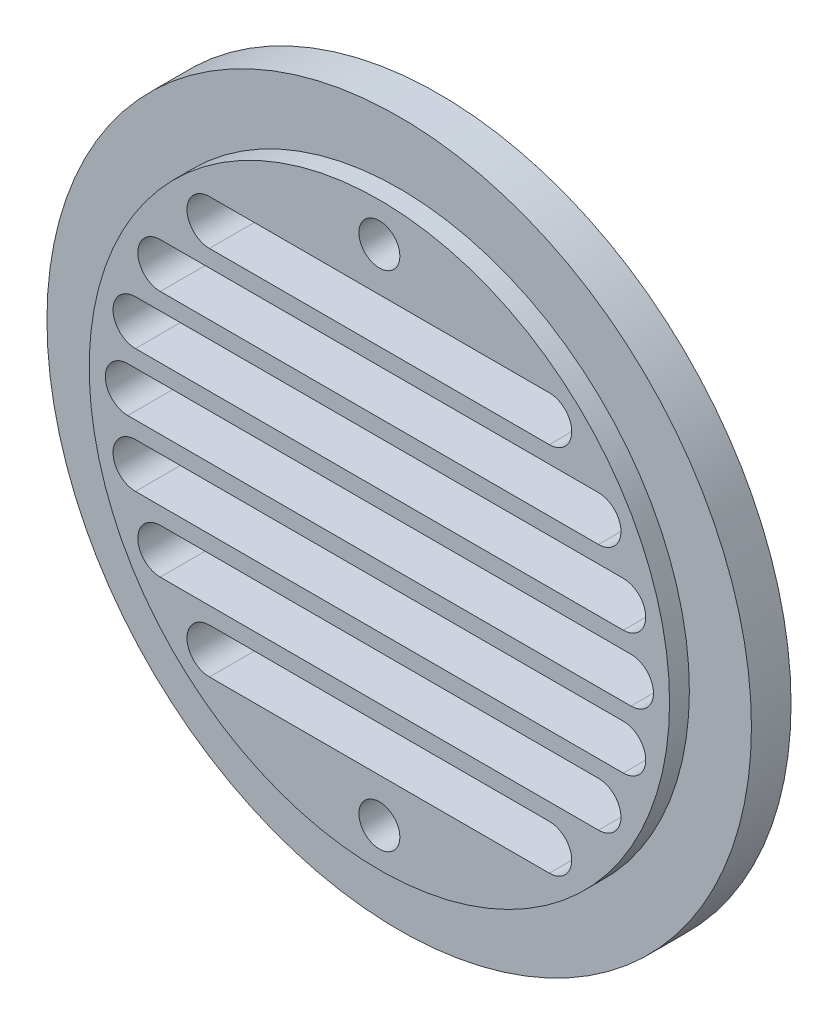
ISO-10303-21;
HEADER;
FILE_DESCRIPTION(('STEP AP214'),'2;1');
FILE_NAME('part.step','',(''),(''),'','','');
FILE_SCHEMA(('AUTOMOTIVE_DESIGN { 1 0 10303 214 1 1 1 1 }'));
ENDSEC;
DATA;
#1=APPLICATION_CONTEXT('core data for automotive mechanical design processes');
#2=APPLICATION_PROTOCOL_DEFINITION('international standard','automotive_design',2000,#1);
#3=PRODUCT_CONTEXT('',#1,'mechanical');
#4=PRODUCT('Part','Part','',(#3));
#5=PRODUCT_RELATED_PRODUCT_CATEGORY('part','',(#4));
#6=PRODUCT_DEFINITION_FORMATION('','',#4);
#7=PRODUCT_DEFINITION_CONTEXT('part definition',#1,'design');
#8=PRODUCT_DEFINITION('design','',#6,#7);
#9=PRODUCT_DEFINITION_SHAPE('','',#8);
#10=(LENGTH_UNIT() NAMED_UNIT(*) SI_UNIT(.MILLI.,.METRE.));
#11=(NAMED_UNIT(*) PLANE_ANGLE_UNIT() SI_UNIT($,.RADIAN.));
#12=(NAMED_UNIT(*) SI_UNIT($,.STERADIAN.) SOLID_ANGLE_UNIT());
#13=UNCERTAINTY_MEASURE_WITH_UNIT(LENGTH_MEASURE(1.E-05),#10,'distance_accuracy_value','');
#14=(GEOMETRIC_REPRESENTATION_CONTEXT(3) GLOBAL_UNCERTAINTY_ASSIGNED_CONTEXT((#13)) GLOBAL_UNIT_ASSIGNED_CONTEXT((#10,
#11,#12)) REPRESENTATION_CONTEXT('',''));
#15=CARTESIAN_POINT('',(0.,0.,0.));
#16=DIRECTION('',(0.,0.,1.));
#17=DIRECTION('',(1.,0.,0.));
#18=AXIS2_PLACEMENT_3D('',#15,#16,#17);
#19=CARTESIAN_POINT('',(0.,0.,3.));
#20=DIRECTION('',(0.,0.,-1.));
#21=DIRECTION('',(-1.,0.,0.));
#22=AXIS2_PLACEMENT_3D('',#19,#20,#21);
#23=CYLINDRICAL_SURFACE('',#22,26.67);
#24=CARTESIAN_POINT('',(0.,0.,3.));
#25=DIRECTION('',(0.,0.,1.));
#26=DIRECTION('',(1.,0.,0.));
#27=AXIS2_PLACEMENT_3D('',#24,#25,#26);
#28=CIRCLE('',#27,26.67);
#29=CARTESIAN_POINT('',(26.67,0.,3.));
#30=VERTEX_POINT('',#29);
#31=EDGE_CURVE('E12',#30,#30,#28,.T.);
#32=ORIENTED_EDGE('',*,*,#31,.F.);
#33=EDGE_LOOP('',(#32));
#34=FACE_BOUND('',#33,.T.);
#35=CARTESIAN_POINT('',(0.,0.,0.));
#36=DIRECTION('',(0.,0.,1.));
#37=DIRECTION('',(1.,0.,0.));
#38=AXIS2_PLACEMENT_3D('',#35,#36,#37);
#39=CIRCLE('',#38,26.67);
#40=CARTESIAN_POINT('',(26.67,0.,0.));
#41=VERTEX_POINT('',#40);
#42=EDGE_CURVE('E44',#41,#41,#39,.T.);
#43=ORIENTED_EDGE('',*,*,#42,.T.);
#44=EDGE_LOOP('',(#43));
#45=FACE_BOUND('',#44,.T.);
#46=ADVANCED_FACE('F41',(#34,#45),#23,.T.);
#47=CARTESIAN_POINT('',(0.,0.,3.));
#48=DIRECTION('',(0.,0.,1.));
#49=DIRECTION('',(1.,0.,0.));
#50=AXIS2_PLACEMENT_3D('',#47,#48,#49);
#51=PLANE('',#50);
#52=CARTESIAN_POINT('',(0.,0.,3.));
#53=DIRECTION('',(0.,0.,1.));
#54=DIRECTION('',(1.,0.,0.));
#55=AXIS2_PLACEMENT_3D('',#52,#53,#54);
#56=CIRCLE('',#55,21.971);
#57=CARTESIAN_POINT('',(21.971,0.,3.));
#58=VERTEX_POINT('',#57);
#59=EDGE_CURVE('E462',#58,#58,#56,.F.);
#60=ORIENTED_EDGE('',*,*,#59,.T.);
#61=EDGE_LOOP('',(#60));
#62=FACE_BOUND('',#61,.T.);
#63=ORIENTED_EDGE('',*,*,#31,.T.);
#64=EDGE_LOOP('',(#63));
#65=FACE_BOUND('',#64,.T.);
#66=ADVANCED_FACE('F474',(#62,#65),#51,.T.);
#67=CARTESIAN_POINT('',(0.,0.,0.));
#68=DIRECTION('',(0.,0.,1.));
#69=DIRECTION('',(1.,0.,0.));
#70=AXIS2_PLACEMENT_3D('',#67,#68,#69);
#71=PLANE('',#70);
#72=CARTESIAN_POINT('',(0.,19.05,0.));
#73=DIRECTION('',(0.,0.,1.));
#74=DIRECTION('',(1.,0.,0.));
#75=AXIS2_PLACEMENT_3D('',#72,#73,#74);
#76=CIRCLE('',#75,1.55);
#77=CARTESIAN_POINT('',(1.55,19.05,0.));
#78=VERTEX_POINT('',#77);
#79=EDGE_CURVE('E463',#78,#78,#76,.T.);
#80=ORIENTED_EDGE('',*,*,#79,.T.);
#81=EDGE_LOOP('',(#80));
#82=FACE_BOUND('',#81,.T.);
#83=DIRECTION('',(-1.,0.,0.));
#84=VECTOR('',#83,1.);
#85=CARTESIAN_POINT('',(-12.8646803302686,-12.35,0.));
#86=LINE('',#85,#84);
#87=CARTESIAN_POINT('',(12.8646803302686,-12.35,0.));
#88=VERTEX_POINT('',#87);
#89=CARTESIAN_POINT('',(-12.8646803302686,-12.35,0.));
#90=VERTEX_POINT('',#89);
#91=EDGE_CURVE('E333',#88,#90,#86,.T.);
#92=ORIENTED_EDGE('',*,*,#91,.T.);
#93=CARTESIAN_POINT('',(-12.8646803302686,-14.05,0.));
#94=DIRECTION('',(0.,0.,1.));
#95=DIRECTION('',(-1.,0.,0.));
#96=AXIS2_PLACEMENT_3D('',#93,#94,#95);
#97=CIRCLE('',#96,1.7);
#98=CARTESIAN_POINT('',(-12.8646803302686,-15.75,0.));
#99=VERTEX_POINT('',#98);
#100=EDGE_CURVE('E344',#90,#99,#97,.T.);
#101=ORIENTED_EDGE('',*,*,#100,.T.);
#102=DIRECTION('',(1.,0.,0.));
#103=VECTOR('',#102,1.);
#104=CARTESIAN_POINT('',(-12.8646803302686,-15.75,0.));
#105=LINE('',#104,#103);
#106=CARTESIAN_POINT('',(12.8646803302686,-15.75,0.));
#107=VERTEX_POINT('',#106);
#108=EDGE_CURVE('E354',#99,#107,#105,.T.);
#109=ORIENTED_EDGE('',*,*,#108,.T.);
#110=CARTESIAN_POINT('',(12.8646803302686,-14.05,0.));
#111=DIRECTION('',(0.,0.,1.));
#112=DIRECTION('',(1.,0.,0.));
#113=AXIS2_PLACEMENT_3D('',#110,#111,#112);
#114=CIRCLE('',#113,1.7);
#115=EDGE_CURVE('E55',#107,#88,#114,.T.);
#116=ORIENTED_EDGE('',*,*,#115,.T.);
#117=EDGE_LOOP('',(#92,#101,#109,#116));
#118=FACE_BOUND('',#117,.T.);
#119=DIRECTION('',(-1.,0.,0.));
#120=VECTOR('',#119,1.);
#121=CARTESIAN_POINT('',(-16.5881902435304,-7.66666666666667,0.));
#122=LINE('',#121,#120);
#123=CARTESIAN_POINT('',(16.5881902435304,-7.66666666666667,0.));
#124=VERTEX_POINT('',#123);
#125=CARTESIAN_POINT('',(-16.5881902435304,-7.66666666666667,0.));
#126=VERTEX_POINT('',#125);
#127=EDGE_CURVE('E303',#124,#126,#122,.T.);
#128=ORIENTED_EDGE('',*,*,#127,.T.);
#129=CARTESIAN_POINT('',(-16.5881902435304,-9.36666666666667,0.));
#130=DIRECTION('',(0.,0.,1.));
#131=DIRECTION('',(-1.,0.,0.));
#132=AXIS2_PLACEMENT_3D('',#129,#130,#131);
#133=CIRCLE('',#132,1.7);
#134=CARTESIAN_POINT('',(-16.5881902435304,-11.0666666666667,0.));
#135=VERTEX_POINT('',#134);
#136=EDGE_CURVE('E315',#126,#135,#133,.T.);
#137=ORIENTED_EDGE('',*,*,#136,.T.);
#138=DIRECTION('',(1.,0.,0.));
#139=VECTOR('',#138,1.);
#140=CARTESIAN_POINT('',(-16.5881902435304,-11.0666666666667,0.));
#141=LINE('',#140,#139);
#142=CARTESIAN_POINT('',(16.5881902435304,-11.0666666666667,0.));
#143=VERTEX_POINT('',#142);
#144=EDGE_CURVE('E325',#135,#143,#141,.T.);
#145=ORIENTED_EDGE('',*,*,#144,.T.);
#146=CARTESIAN_POINT('',(16.5881902435304,-9.36666666666667,0.));
#147=DIRECTION('',(0.,0.,1.));
#148=DIRECTION('',(1.,0.,0.));
#149=AXIS2_PLACEMENT_3D('',#146,#147,#148);
#150=CIRCLE('',#149,1.7);
#151=EDGE_CURVE('E63',#143,#124,#150,.T.);
#152=ORIENTED_EDGE('',*,*,#151,.T.);
#153=EDGE_LOOP('',(#128,#137,#145,#152));
#154=FACE_BOUND('',#153,.T.);
#155=DIRECTION('',(-1.,0.,0.));
#156=VECTOR('',#155,1.);
#157=CARTESIAN_POINT('',(-18.4653429128432,-2.98333333333333,0.));
#158=LINE('',#157,#156);
#159=CARTESIAN_POINT('',(18.4653429128432,-2.98333333333333,0.));
#160=VERTEX_POINT('',#159);
#161=CARTESIAN_POINT('',(-18.4653429128432,-2.98333333333333,0.));
#162=VERTEX_POINT('',#161);
#163=EDGE_CURVE('E271',#160,#162,#158,.T.);
#164=ORIENTED_EDGE('',*,*,#163,.T.);
#165=CARTESIAN_POINT('',(-18.4653429128432,-4.68333333333333,0.));
#166=DIRECTION('',(0.,0.,1.));
#167=DIRECTION('',(-1.,0.,0.));
#168=AXIS2_PLACEMENT_3D('',#165,#166,#167);
#169=CIRCLE('',#168,1.7);
#170=CARTESIAN_POINT('',(-18.4653429128432,-6.38333333333333,0.));
#171=VERTEX_POINT('',#170);
#172=EDGE_CURVE('E283',#162,#171,#169,.T.);
#173=ORIENTED_EDGE('',*,*,#172,.T.);
#174=DIRECTION('',(1.,0.,0.));
#175=VECTOR('',#174,1.);
#176=CARTESIAN_POINT('',(-18.4653429128432,-6.38333333333333,0.));
#177=LINE('',#176,#175);
#178=CARTESIAN_POINT('',(18.4653429128432,-6.38333333333333,0.));
#179=VERTEX_POINT('',#178);
#180=EDGE_CURVE('E295',#171,#179,#177,.T.);
#181=ORIENTED_EDGE('',*,*,#180,.T.);
#182=CARTESIAN_POINT('',(18.4653429128432,-4.68333333333333,0.));
#183=DIRECTION('',(0.,0.,1.));
#184=DIRECTION('',(1.,0.,0.));
#185=AXIS2_PLACEMENT_3D('',#182,#183,#184);
#186=CIRCLE('',#185,1.7);
#187=EDGE_CURVE('E292',#179,#160,#186,.T.);
#188=ORIENTED_EDGE('',*,*,#187,.T.);
#189=EDGE_LOOP('',(#164,#173,#181,#188));
#190=FACE_BOUND('',#189,.T.);
#191=DIRECTION('',(-1.,0.,0.));
#192=VECTOR('',#191,1.);
#193=CARTESIAN_POINT('',(-19.05,1.7,0.));
#194=LINE('',#193,#192);
#195=CARTESIAN_POINT('',(19.05,1.7,0.));
#196=VERTEX_POINT('',#195);
#197=CARTESIAN_POINT('',(-19.05,1.7,0.));
#198=VERTEX_POINT('',#197);
#199=EDGE_CURVE('E258',#196,#198,#194,.T.);
#200=ORIENTED_EDGE('',*,*,#199,.T.);
#201=CARTESIAN_POINT('',(-19.05,0.,0.));
#202=DIRECTION('',(0.,0.,1.));
#203=DIRECTION('',(-1.,0.,0.));
#204=AXIS2_PLACEMENT_3D('',#201,#202,#203);
#205=CIRCLE('',#204,1.7);
#206=CARTESIAN_POINT('',(-19.05,-1.7,0.));
#207=VERTEX_POINT('',#206);
#208=EDGE_CURVE('E231',#198,#207,#205,.T.);
#209=ORIENTED_EDGE('',*,*,#208,.T.);
#210=DIRECTION('',(1.,0.,0.));
#211=VECTOR('',#210,1.);
#212=CARTESIAN_POINT('',(-19.05,-1.7,0.));
#213=LINE('',#212,#211);
#214=CARTESIAN_POINT('',(19.05,-1.7,0.));
#215=VERTEX_POINT('',#214);
#216=EDGE_CURVE('E264',#207,#215,#213,.T.);
#217=ORIENTED_EDGE('',*,*,#216,.T.);
#218=CARTESIAN_POINT('',(19.05,0.,0.));
#219=DIRECTION('',(0.,0.,1.));
#220=DIRECTION('',(1.,0.,0.));
#221=AXIS2_PLACEMENT_3D('',#218,#219,#220);
#222=CIRCLE('',#221,1.7);
#223=EDGE_CURVE('E260',#215,#196,#222,.T.);
#224=ORIENTED_EDGE('',*,*,#223,.T.);
#225=EDGE_LOOP('',(#200,#209,#217,#224));
#226=FACE_BOUND('',#225,.T.);
#227=CARTESIAN_POINT('',(0.,-19.05,0.));
#228=DIRECTION('',(0.,0.,1.));
#229=DIRECTION('',(1.,0.,0.));
#230=AXIS2_PLACEMENT_3D('',#227,#228,#229);
#231=CIRCLE('',#230,1.55);
#232=CARTESIAN_POINT('',(1.55,-19.05,0.));
#233=VERTEX_POINT('',#232);
#234=EDGE_CURVE('E425',#233,#233,#231,.T.);
#235=ORIENTED_EDGE('',*,*,#234,.T.);
#236=EDGE_LOOP('',(#235));
#237=FACE_BOUND('',#236,.T.);
#238=DIRECTION('',(-1.,0.,0.));
#239=VECTOR('',#238,1.);
#240=CARTESIAN_POINT('',(-12.8646803302686,15.75,0.));
#241=LINE('',#240,#239);
#242=CARTESIAN_POINT('',(12.8646803302686,15.75,0.));
#243=VERTEX_POINT('',#242);
#244=CARTESIAN_POINT('',(-12.8646803302686,15.75,0.));
#245=VERTEX_POINT('',#244);
#246=EDGE_CURVE('E432',#243,#245,#241,.T.);
#247=ORIENTED_EDGE('',*,*,#246,.T.);
#248=CARTESIAN_POINT('',(-12.8646803302686,14.05,0.));
#249=DIRECTION('',(0.,0.,1.));
#250=DIRECTION('',(-1.,0.,0.));
#251=AXIS2_PLACEMENT_3D('',#248,#249,#250);
#252=CIRCLE('',#251,1.7);
#253=CARTESIAN_POINT('',(-12.8646803302686,12.35,0.));
#254=VERTEX_POINT('',#253);
#255=EDGE_CURVE('E442',#245,#254,#252,.T.);
#256=ORIENTED_EDGE('',*,*,#255,.T.);
#257=DIRECTION('',(1.,0.,0.));
#258=VECTOR('',#257,1.);
#259=CARTESIAN_POINT('',(-12.8646803302686,12.35,0.));
#260=LINE('',#259,#258);
#261=CARTESIAN_POINT('',(12.8646803302686,12.35,0.));
#262=VERTEX_POINT('',#261);
#263=EDGE_CURVE('E454',#254,#262,#260,.T.);
#264=ORIENTED_EDGE('',*,*,#263,.T.);
#265=CARTESIAN_POINT('',(12.8646803302686,14.05,0.));
#266=DIRECTION('',(0.,0.,1.));
#267=DIRECTION('',(1.,0.,0.));
#268=AXIS2_PLACEMENT_3D('',#265,#266,#267);
#269=CIRCLE('',#268,1.7);
#270=EDGE_CURVE('E451',#262,#243,#269,.T.);
#271=ORIENTED_EDGE('',*,*,#270,.T.);
#272=EDGE_LOOP('',(#247,#256,#264,#271));
#273=FACE_BOUND('',#272,.T.);
#274=DIRECTION('',(-1.,0.,0.));
#275=VECTOR('',#274,1.);
#276=CARTESIAN_POINT('',(-16.5881902435304,11.0666666666667,0.));
#277=LINE('',#276,#275);
#278=CARTESIAN_POINT('',(16.5881902435304,11.0666666666667,0.));
#279=VERTEX_POINT('',#278);
#280=CARTESIAN_POINT('',(-16.5881902435304,11.0666666666667,0.));
#281=VERTEX_POINT('',#280);
#282=EDGE_CURVE('E362',#279,#281,#277,.T.);
#283=ORIENTED_EDGE('',*,*,#282,.T.);
#284=CARTESIAN_POINT('',(-16.5881902435304,9.36666666666667,0.));
#285=DIRECTION('',(0.,0.,1.));
#286=DIRECTION('',(-1.,0.,0.));
#287=AXIS2_PLACEMENT_3D('',#284,#285,#286);
#288=CIRCLE('',#287,1.7);
#289=CARTESIAN_POINT('',(-16.5881902435304,7.66666666666667,0.));
#290=VERTEX_POINT('',#289);
#291=EDGE_CURVE('E374',#281,#290,#288,.T.);
#292=ORIENTED_EDGE('',*,*,#291,.T.);
#293=DIRECTION('',(1.,0.,0.));
#294=VECTOR('',#293,1.);
#295=CARTESIAN_POINT('',(-16.5881902435304,7.66666666666667,0.));
#296=LINE('',#295,#294);
#297=CARTESIAN_POINT('',(16.5881902435304,7.66666666666667,0.));
#298=VERTEX_POINT('',#297);
#299=EDGE_CURVE('E388',#290,#298,#296,.T.);
#300=ORIENTED_EDGE('',*,*,#299,.T.);
#301=CARTESIAN_POINT('',(16.5881902435304,9.36666666666667,0.));
#302=DIRECTION('',(0.,0.,1.));
#303=DIRECTION('',(1.,0.,0.));
#304=AXIS2_PLACEMENT_3D('',#301,#302,#303);
#305=CIRCLE('',#304,1.7);
#306=EDGE_CURVE('E385',#298,#279,#305,.T.);
#307=ORIENTED_EDGE('',*,*,#306,.T.);
#308=EDGE_LOOP('',(#283,#292,#300,#307));
#309=FACE_BOUND('',#308,.T.);
#310=DIRECTION('',(-1.,0.,0.));
#311=VECTOR('',#310,1.);
#312=CARTESIAN_POINT('',(-18.4653429128432,6.38333333333333,0.));
#313=LINE('',#312,#311);
#314=CARTESIAN_POINT('',(18.4653429128432,6.38333333333333,0.));
#315=VERTEX_POINT('',#314);
#316=CARTESIAN_POINT('',(-18.4653429128432,6.38333333333333,0.));
#317=VERTEX_POINT('',#316);
#318=EDGE_CURVE('E396',#315,#317,#313,.T.);
#319=ORIENTED_EDGE('',*,*,#318,.T.);
#320=CARTESIAN_POINT('',(-18.4653429128432,4.68333333333333,0.));
#321=DIRECTION('',(0.,0.,1.));
#322=DIRECTION('',(-1.,0.,0.));
#323=AXIS2_PLACEMENT_3D('',#320,#321,#322);
#324=CIRCLE('',#323,1.7);
#325=CARTESIAN_POINT('',(-18.4653429128432,2.98333333333333,0.));
#326=VERTEX_POINT('',#325);
#327=EDGE_CURVE('E404',#317,#326,#324,.T.);
#328=ORIENTED_EDGE('',*,*,#327,.T.);
#329=DIRECTION('',(1.,0.,0.));
#330=VECTOR('',#329,1.);
#331=CARTESIAN_POINT('',(-18.4653429128432,2.98333333333333,0.));
#332=LINE('',#331,#330);
#333=CARTESIAN_POINT('',(18.4653429128432,2.98333333333333,0.));
#334=VERTEX_POINT('',#333);
#335=EDGE_CURVE('E416',#326,#334,#332,.T.);
#336=ORIENTED_EDGE('',*,*,#335,.T.);
#337=CARTESIAN_POINT('',(18.4653429128432,4.68333333333333,0.));
#338=DIRECTION('',(0.,0.,1.));
#339=DIRECTION('',(1.,0.,0.));
#340=AXIS2_PLACEMENT_3D('',#337,#338,#339);
#341=CIRCLE('',#340,1.7);
#342=EDGE_CURVE('E413',#334,#315,#341,.T.);
#343=ORIENTED_EDGE('',*,*,#342,.T.);
#344=EDGE_LOOP('',(#319,#328,#336,#343));
#345=FACE_BOUND('',#344,.T.);
#346=ORIENTED_EDGE('',*,*,#42,.F.);
#347=EDGE_LOOP('',(#346));
#348=FACE_BOUND('',#347,.T.);
#349=ADVANCED_FACE('F471',(#82,#118,#154,#190,#226,#237,#273,#309,#345,#348),#71,.F.);
#350=CARTESIAN_POINT('',(0.,0.,68.1433723577985));
#351=DIRECTION('',(0.,0.,-1.));
#352=DIRECTION('',(-1.,0.,0.));
#353=AXIS2_PLACEMENT_3D('',#350,#351,#352);
#354=CYLINDRICAL_SURFACE('',#353,21.971);
#355=ORIENTED_EDGE('',*,*,#59,.F.);
#356=EDGE_LOOP('',(#355));
#357=FACE_BOUND('',#356,.T.);
#358=CARTESIAN_POINT('',(0.,0.,4.5));
#359=DIRECTION('',(0.,0.,1.));
#360=DIRECTION('',(1.,0.,0.));
#361=AXIS2_PLACEMENT_3D('',#358,#359,#360);
#362=CIRCLE('',#361,21.971);
#363=CARTESIAN_POINT('',(21.971,0.,4.5));
#364=VERTEX_POINT('',#363);
#365=EDGE_CURVE('E459',#364,#364,#362,.T.);
#366=ORIENTED_EDGE('',*,*,#365,.F.);
#367=EDGE_LOOP('',(#366));
#368=FACE_BOUND('',#367,.T.);
#369=ADVANCED_FACE('F473',(#357,#368),#354,.T.);
#370=CARTESIAN_POINT('',(0.,0.,4.5));
#371=DIRECTION('',(0.,0.,1.));
#372=DIRECTION('',(1.,0.,0.));
#373=AXIS2_PLACEMENT_3D('',#370,#371,#372);
#374=PLANE('',#373);
#375=CARTESIAN_POINT('',(0.,19.05,4.5));
#376=DIRECTION('',(0.,0.,1.));
#377=DIRECTION('',(1.,0.,0.));
#378=AXIS2_PLACEMENT_3D('',#375,#376,#377);
#379=CIRCLE('',#378,1.55);
#380=CARTESIAN_POINT('',(1.55,19.05,4.5));
#381=VERTEX_POINT('',#380);
#382=EDGE_CURVE('E424',#381,#381,#379,.T.);
#383=ORIENTED_EDGE('',*,*,#382,.F.);
#384=EDGE_LOOP('',(#383));
#385=FACE_BOUND('',#384,.T.);
#386=CARTESIAN_POINT('',(-12.8646803302686,-14.05,4.5));
#387=DIRECTION('',(0.,0.,1.));
#388=DIRECTION('',(-1.,0.,0.));
#389=AXIS2_PLACEMENT_3D('',#386,#387,#388);
#390=CIRCLE('',#389,1.7);
#391=CARTESIAN_POINT('',(-12.8646803302686,-12.35,4.5));
#392=VERTEX_POINT('',#391);
#393=CARTESIAN_POINT('',(-12.8646803302686,-15.75,4.5));
#394=VERTEX_POINT('',#393);
#395=EDGE_CURVE('E310',#392,#394,#390,.T.);
#396=ORIENTED_EDGE('',*,*,#395,.F.);
#397=DIRECTION('',(-1.,0.,0.));
#398=VECTOR('',#397,1.);
#399=CARTESIAN_POINT('',(-12.8646803302686,-12.35,4.5));
#400=LINE('',#399,#398);
#401=CARTESIAN_POINT('',(12.8646803302686,-12.35,4.5));
#402=VERTEX_POINT('',#401);
#403=EDGE_CURVE('E340',#402,#392,#400,.T.);
#404=ORIENTED_EDGE('',*,*,#403,.F.);
#405=CARTESIAN_POINT('',(12.8646803302686,-14.05,4.5));
#406=DIRECTION('',(0.,0.,1.));
#407=DIRECTION('',(1.,0.,0.));
#408=AXIS2_PLACEMENT_3D('',#405,#406,#407);
#409=CIRCLE('',#408,1.7);
#410=CARTESIAN_POINT('',(12.8646803302686,-15.75,4.5));
#411=VERTEX_POINT('',#410);
#412=EDGE_CURVE('E343',#411,#402,#409,.T.);
#413=ORIENTED_EDGE('',*,*,#412,.F.);
#414=DIRECTION('',(1.,0.,0.));
#415=VECTOR('',#414,1.);
#416=CARTESIAN_POINT('',(-12.8646803302686,-15.75,4.5));
#417=LINE('',#416,#415);
#418=EDGE_CURVE('E347',#394,#411,#417,.T.);
#419=ORIENTED_EDGE('',*,*,#418,.F.);
#420=EDGE_LOOP('',(#396,#404,#413,#419));
#421=FACE_BOUND('',#420,.T.);
#422=CARTESIAN_POINT('',(-16.5881902435304,-9.36666666666667,4.5));
#423=DIRECTION('',(0.,0.,1.));
#424=DIRECTION('',(-1.,0.,0.));
#425=AXIS2_PLACEMENT_3D('',#422,#423,#424);
#426=CIRCLE('',#425,1.7);
#427=CARTESIAN_POINT('',(-16.5881902435304,-7.66666666666667,4.5));
#428=VERTEX_POINT('',#427);
#429=CARTESIAN_POINT('',(-16.5881902435304,-11.0666666666667,4.5));
#430=VERTEX_POINT('',#429);
#431=EDGE_CURVE('E278',#428,#430,#426,.T.);
#432=ORIENTED_EDGE('',*,*,#431,.F.);
#433=DIRECTION('',(-1.,0.,0.));
#434=VECTOR('',#433,1.);
#435=CARTESIAN_POINT('',(-16.5881902435304,-7.66666666666667,4.5));
#436=LINE('',#435,#434);
#437=CARTESIAN_POINT('',(16.5881902435304,-7.66666666666667,4.5));
#438=VERTEX_POINT('',#437);
#439=EDGE_CURVE('E311',#438,#428,#436,.T.);
#440=ORIENTED_EDGE('',*,*,#439,.F.);
#441=CARTESIAN_POINT('',(16.5881902435304,-9.36666666666667,4.5));
#442=DIRECTION('',(0.,0.,1.));
#443=DIRECTION('',(1.,0.,0.));
#444=AXIS2_PLACEMENT_3D('',#441,#442,#443);
#445=CIRCLE('',#444,1.7);
#446=CARTESIAN_POINT('',(16.5881902435304,-11.0666666666667,4.5));
#447=VERTEX_POINT('',#446);
#448=EDGE_CURVE('E314',#447,#438,#445,.T.);
#449=ORIENTED_EDGE('',*,*,#448,.F.);
#450=DIRECTION('',(1.,0.,0.));
#451=VECTOR('',#450,1.);
#452=CARTESIAN_POINT('',(-16.5881902435304,-11.0666666666667,4.5));
#453=LINE('',#452,#451);
#454=EDGE_CURVE('E318',#430,#447,#453,.T.);
#455=ORIENTED_EDGE('',*,*,#454,.F.);
#456=EDGE_LOOP('',(#432,#440,#449,#455));
#457=FACE_BOUND('',#456,.T.);
#458=CARTESIAN_POINT('',(-18.4653429128432,-4.68333333333333,4.5));
#459=DIRECTION('',(0.,0.,1.));
#460=DIRECTION('',(-1.,0.,0.));
#461=AXIS2_PLACEMENT_3D('',#458,#459,#460);
#462=CIRCLE('',#461,1.7);
#463=CARTESIAN_POINT('',(-18.4653429128432,-2.98333333333333,4.5));
#464=VERTEX_POINT('',#463);
#465=CARTESIAN_POINT('',(-18.4653429128432,-6.38333333333333,4.5));
#466=VERTEX_POINT('',#465);
#467=EDGE_CURVE('E236',#464,#466,#462,.T.);
#468=ORIENTED_EDGE('',*,*,#467,.F.);
#469=DIRECTION('',(-1.,0.,0.));
#470=VECTOR('',#469,1.);
#471=CARTESIAN_POINT('',(-18.4653429128432,-2.98333333333333,4.5));
#472=LINE('',#471,#470);
#473=CARTESIAN_POINT('',(18.4653429128432,-2.98333333333333,4.5));
#474=VERTEX_POINT('',#473);
#475=EDGE_CURVE('E279',#474,#464,#472,.T.);
#476=ORIENTED_EDGE('',*,*,#475,.F.);
#477=CARTESIAN_POINT('',(18.4653429128432,-4.68333333333333,4.5));
#478=DIRECTION('',(0.,0.,1.));
#479=DIRECTION('',(1.,0.,0.));
#480=AXIS2_PLACEMENT_3D('',#477,#478,#479);
#481=CIRCLE('',#480,1.7);
#482=CARTESIAN_POINT('',(18.4653429128432,-6.38333333333333,4.5));
#483=VERTEX_POINT('',#482);
#484=EDGE_CURVE('E282',#483,#474,#481,.T.);
#485=ORIENTED_EDGE('',*,*,#484,.F.);
#486=DIRECTION('',(1.,0.,0.));
#487=VECTOR('',#486,1.);
#488=CARTESIAN_POINT('',(-18.4653429128432,-6.38333333333333,4.5));
#489=LINE('',#488,#487);
#490=EDGE_CURVE('E286',#466,#483,#489,.T.);
#491=ORIENTED_EDGE('',*,*,#490,.F.);
#492=EDGE_LOOP('',(#468,#476,#485,#491));
#493=FACE_BOUND('',#492,.T.);
#494=CARTESIAN_POINT('',(-19.05,0.,4.5));
#495=DIRECTION('',(0.,0.,1.));
#496=DIRECTION('',(-1.,0.,0.));
#497=AXIS2_PLACEMENT_3D('',#494,#495,#496);
#498=CIRCLE('',#497,1.7);
#499=CARTESIAN_POINT('',(-19.05,1.7,4.5));
#500=VERTEX_POINT('',#499);
#501=CARTESIAN_POINT('',(-19.05,-1.7,4.5));
#502=VERTEX_POINT('',#501);
#503=EDGE_CURVE('E228',#500,#502,#498,.T.);
#504=ORIENTED_EDGE('',*,*,#503,.F.);
#505=DIRECTION('',(-1.,0.,0.));
#506=VECTOR('',#505,1.);
#507=CARTESIAN_POINT('',(-19.05,1.7,4.5));
#508=LINE('',#507,#506);
#509=CARTESIAN_POINT('',(19.05,1.7,4.5));
#510=VERTEX_POINT('',#509);
#511=EDGE_CURVE('E239',#510,#500,#508,.T.);
#512=ORIENTED_EDGE('',*,*,#511,.F.);
#513=CARTESIAN_POINT('',(19.05,0.,4.5));
#514=DIRECTION('',(0.,0.,1.));
#515=DIRECTION('',(1.,0.,0.));
#516=AXIS2_PLACEMENT_3D('',#513,#514,#515);
#517=CIRCLE('',#516,1.7);
#518=CARTESIAN_POINT('',(19.05,-1.7,4.5));
#519=VERTEX_POINT('',#518);
#520=EDGE_CURVE('E244',#519,#510,#517,.T.);
#521=ORIENTED_EDGE('',*,*,#520,.F.);
#522=DIRECTION('',(1.,0.,0.));
#523=VECTOR('',#522,1.);
#524=CARTESIAN_POINT('',(-19.05,-1.7,4.5));
#525=LINE('',#524,#523);
#526=EDGE_CURVE('E250',#502,#519,#525,.T.);
#527=ORIENTED_EDGE('',*,*,#526,.F.);
#528=EDGE_LOOP('',(#504,#512,#521,#527));
#529=FACE_BOUND('',#528,.T.);
#530=CARTESIAN_POINT('',(0.,-19.05,4.5));
#531=DIRECTION('',(0.,0.,1.));
#532=DIRECTION('',(1.,0.,0.));
#533=AXIS2_PLACEMENT_3D('',#530,#531,#532);
#534=CIRCLE('',#533,1.55);
#535=CARTESIAN_POINT('',(1.55,-19.05,4.5));
#536=VERTEX_POINT('',#535);
#537=EDGE_CURVE('E421',#536,#536,#534,.T.);
#538=ORIENTED_EDGE('',*,*,#537,.F.);
#539=EDGE_LOOP('',(#538));
#540=FACE_BOUND('',#539,.T.);
#541=CARTESIAN_POINT('',(-12.8646803302686,14.05,4.5));
#542=DIRECTION('',(0.,0.,1.));
#543=DIRECTION('',(-1.,0.,0.));
#544=AXIS2_PLACEMENT_3D('',#541,#542,#543);
#545=CIRCLE('',#544,1.7);
#546=CARTESIAN_POINT('',(-12.8646803302686,15.75,4.5));
#547=VERTEX_POINT('',#546);
#548=CARTESIAN_POINT('',(-12.8646803302686,12.35,4.5));
#549=VERTEX_POINT('',#548);
#550=EDGE_CURVE('E428',#547,#549,#545,.T.);
#551=ORIENTED_EDGE('',*,*,#550,.F.);
#552=DIRECTION('',(-1.,0.,0.));
#553=VECTOR('',#552,1.);
#554=CARTESIAN_POINT('',(-12.8646803302686,15.75,4.5));
#555=LINE('',#554,#553);
#556=CARTESIAN_POINT('',(12.8646803302686,15.75,4.5));
#557=VERTEX_POINT('',#556);
#558=EDGE_CURVE('E438',#557,#547,#555,.T.);
#559=ORIENTED_EDGE('',*,*,#558,.F.);
#560=CARTESIAN_POINT('',(12.8646803302686,14.05,4.5));
#561=DIRECTION('',(0.,0.,1.));
#562=DIRECTION('',(1.,0.,0.));
#563=AXIS2_PLACEMENT_3D('',#560,#561,#562);
#564=CIRCLE('',#563,1.7);
#565=CARTESIAN_POINT('',(12.8646803302686,12.35,4.5));
#566=VERTEX_POINT('',#565);
#567=EDGE_CURVE('E441',#566,#557,#564,.T.);
#568=ORIENTED_EDGE('',*,*,#567,.F.);
#569=DIRECTION('',(1.,0.,0.));
#570=VECTOR('',#569,1.);
#571=CARTESIAN_POINT('',(-12.8646803302686,12.35,4.5));
#572=LINE('',#571,#570);
#573=EDGE_CURVE('E445',#549,#566,#572,.T.);
#574=ORIENTED_EDGE('',*,*,#573,.F.);
#575=EDGE_LOOP('',(#551,#559,#568,#574));
#576=FACE_BOUND('',#575,.T.);
#577=CARTESIAN_POINT('',(-16.5881902435304,9.36666666666667,4.5));
#578=DIRECTION('',(0.,0.,1.));
#579=DIRECTION('',(-1.,0.,0.));
#580=AXIS2_PLACEMENT_3D('',#577,#578,#579);
#581=CIRCLE('',#580,1.7);
#582=CARTESIAN_POINT('',(-16.5881902435304,11.0666666666667,4.5));
#583=VERTEX_POINT('',#582);
#584=CARTESIAN_POINT('',(-16.5881902435304,7.66666666666667,4.5));
#585=VERTEX_POINT('',#584);
#586=EDGE_CURVE('E380',#583,#585,#581,.T.);
#587=ORIENTED_EDGE('',*,*,#586,.F.);
#588=DIRECTION('',(-1.,0.,0.));
#589=VECTOR('',#588,1.);
#590=CARTESIAN_POINT('',(-16.5881902435304,11.0666666666667,4.5));
#591=LINE('',#590,#589);
#592=CARTESIAN_POINT('',(16.5881902435304,11.0666666666667,4.5));
#593=VERTEX_POINT('',#592);
#594=EDGE_CURVE('E370',#593,#583,#591,.T.);
#595=ORIENTED_EDGE('',*,*,#594,.F.);
#596=CARTESIAN_POINT('',(16.5881902435304,9.36666666666667,4.5));
#597=DIRECTION('',(0.,0.,1.));
#598=DIRECTION('',(1.,0.,0.));
#599=AXIS2_PLACEMENT_3D('',#596,#597,#598);
#600=CIRCLE('',#599,1.7);
#601=CARTESIAN_POINT('',(16.5881902435304,7.66666666666667,4.5));
#602=VERTEX_POINT('',#601);
#603=EDGE_CURVE('E373',#602,#593,#600,.T.);
#604=ORIENTED_EDGE('',*,*,#603,.F.);
#605=DIRECTION('',(1.,0.,0.));
#606=VECTOR('',#605,1.);
#607=CARTESIAN_POINT('',(-16.5881902435304,7.66666666666667,4.5));
#608=LINE('',#607,#606);
#609=EDGE_CURVE('E377',#585,#602,#608,.T.);
#610=ORIENTED_EDGE('',*,*,#609,.F.);
#611=EDGE_LOOP('',(#587,#595,#604,#610));
#612=FACE_BOUND('',#611,.T.);
#613=CARTESIAN_POINT('',(-18.4653429128432,4.68333333333333,4.5));
#614=DIRECTION('',(0.,0.,1.));
#615=DIRECTION('',(-1.,0.,0.));
#616=AXIS2_PLACEMENT_3D('',#613,#614,#615);
#617=CIRCLE('',#616,1.7);
#618=CARTESIAN_POINT('',(-18.4653429128432,6.38333333333333,4.5));
#619=VERTEX_POINT('',#618);
#620=CARTESIAN_POINT('',(-18.4653429128432,2.98333333333333,4.5));
#621=VERTEX_POINT('',#620);
#622=EDGE_CURVE('E369',#619,#621,#617,.T.);
#623=ORIENTED_EDGE('',*,*,#622,.F.);
#624=DIRECTION('',(-1.,0.,0.));
#625=VECTOR('',#624,1.);
#626=CARTESIAN_POINT('',(-18.4653429128432,6.38333333333333,4.5));
#627=LINE('',#626,#625);
#628=CARTESIAN_POINT('',(18.4653429128432,6.38333333333333,4.5));
#629=VERTEX_POINT('',#628);
#630=EDGE_CURVE('E400',#629,#619,#627,.T.);
#631=ORIENTED_EDGE('',*,*,#630,.F.);
#632=CARTESIAN_POINT('',(18.4653429128432,4.68333333333333,4.5));
#633=DIRECTION('',(0.,0.,1.));
#634=DIRECTION('',(1.,0.,0.));
#635=AXIS2_PLACEMENT_3D('',#632,#633,#634);
#636=CIRCLE('',#635,1.7);
#637=CARTESIAN_POINT('',(18.4653429128432,2.98333333333333,4.5));
#638=VERTEX_POINT('',#637);
#639=EDGE_CURVE('E403',#638,#629,#636,.T.);
#640=ORIENTED_EDGE('',*,*,#639,.F.);
#641=DIRECTION('',(1.,0.,0.));
#642=VECTOR('',#641,1.);
#643=CARTESIAN_POINT('',(-18.4653429128432,2.98333333333333,4.5));
#644=LINE('',#643,#642);
#645=EDGE_CURVE('E407',#621,#638,#644,.T.);
#646=ORIENTED_EDGE('',*,*,#645,.F.);
#647=EDGE_LOOP('',(#623,#631,#640,#646));
#648=FACE_BOUND('',#647,.T.);
#649=ORIENTED_EDGE('',*,*,#365,.T.);
#650=EDGE_LOOP('',(#649));
#651=FACE_BOUND('',#650,.T.);
#652=ADVANCED_FACE('F247',(#385,#421,#457,#493,#529,#540,#576,#612,#648,#651),#374,.T.);
#653=CARTESIAN_POINT('',(-18.4653429128432,4.68333333333333,0.));
#654=DIRECTION('',(0.,0.,1.));
#655=DIRECTION('',(1.,0.,0.));
#656=AXIS2_PLACEMENT_3D('',#653,#654,#655);
#657=CYLINDRICAL_SURFACE('',#656,1.7);
#658=ORIENTED_EDGE('',*,*,#622,.T.);
#659=DIRECTION('',(0.,0.,1.));
#660=VECTOR('',#659,1.);
#661=CARTESIAN_POINT('',(-18.4653429128432,2.98333333333333,0.));
#662=LINE('',#661,#660);
#663=EDGE_CURVE('E393',#326,#621,#662,.T.);
#664=ORIENTED_EDGE('',*,*,#663,.F.);
#665=ORIENTED_EDGE('',*,*,#327,.F.);
#666=DIRECTION('',(0.,0.,1.));
#667=VECTOR('',#666,1.);
#668=CARTESIAN_POINT('',(-18.4653429128432,6.38333333333333,0.));
#669=LINE('',#668,#667);
#670=EDGE_CURVE('E251',#317,#619,#669,.T.);
#671=ORIENTED_EDGE('',*,*,#670,.T.);
#672=EDGE_LOOP('',(#658,#664,#665,#671));
#673=FACE_BOUND('',#672,.T.);
#674=ADVANCED_FACE('F517',(#673),#657,.F.);
#675=CARTESIAN_POINT('',(-18.4653429128432,6.38333333333333,0.));
#676=DIRECTION('',(0.,1.,0.));
#677=DIRECTION('',(0.,0.,1.));
#678=AXIS2_PLACEMENT_3D('',#675,#676,#677);
#679=PLANE('',#678);
#680=ORIENTED_EDGE('',*,*,#630,.T.);
#681=ORIENTED_EDGE('',*,*,#670,.F.);
#682=ORIENTED_EDGE('',*,*,#318,.F.);
#683=DIRECTION('',(0.,0.,1.));
#684=VECTOR('',#683,1.);
#685=CARTESIAN_POINT('',(18.4653429128432,6.38333333333333,0.));
#686=LINE('',#685,#684);
#687=EDGE_CURVE('E253',#315,#629,#686,.T.);
#688=ORIENTED_EDGE('',*,*,#687,.T.);
#689=EDGE_LOOP('',(#680,#681,#682,#688));
#690=FACE_BOUND('',#689,.T.);
#691=ADVANCED_FACE('F528',(#690),#679,.F.);
#692=CARTESIAN_POINT('',(18.4653429128432,4.68333333333333,0.));
#693=DIRECTION('',(0.,0.,1.));
#694=DIRECTION('',(1.,0.,0.));
#695=AXIS2_PLACEMENT_3D('',#692,#693,#694);
#696=CYLINDRICAL_SURFACE('',#695,1.7);
#697=ORIENTED_EDGE('',*,*,#639,.T.);
#698=ORIENTED_EDGE('',*,*,#687,.F.);
#699=ORIENTED_EDGE('',*,*,#342,.F.);
#700=DIRECTION('',(0.,0.,1.));
#701=VECTOR('',#700,1.);
#702=CARTESIAN_POINT('',(18.4653429128432,2.98333333333333,0.));
#703=LINE('',#702,#701);
#704=EDGE_CURVE('E397',#334,#638,#703,.T.);
#705=ORIENTED_EDGE('',*,*,#704,.T.);
#706=EDGE_LOOP('',(#697,#698,#699,#705));
#707=FACE_BOUND('',#706,.T.);
#708=ADVANCED_FACE('F539',(#707),#696,.F.);
#709=CARTESIAN_POINT('',(-18.4653429128432,2.98333333333333,0.));
#710=DIRECTION('',(0.,-1.,0.));
#711=DIRECTION('',(0.,0.,-1.));
#712=AXIS2_PLACEMENT_3D('',#709,#710,#711);
#713=PLANE('',#712);
#714=ORIENTED_EDGE('',*,*,#645,.T.);
#715=ORIENTED_EDGE('',*,*,#704,.F.);
#716=ORIENTED_EDGE('',*,*,#335,.F.);
#717=ORIENTED_EDGE('',*,*,#663,.T.);
#718=EDGE_LOOP('',(#714,#715,#716,#717));
#719=FACE_BOUND('',#718,.T.);
#720=ADVANCED_FACE('F550',(#719),#713,.F.);
#721=CARTESIAN_POINT('',(-16.5881902435304,9.36666666666667,0.));
#722=DIRECTION('',(0.,0.,1.));
#723=DIRECTION('',(1.,0.,0.));
#724=AXIS2_PLACEMENT_3D('',#721,#722,#723);
#725=CYLINDRICAL_SURFACE('',#724,1.7);
#726=ORIENTED_EDGE('',*,*,#586,.T.);
#727=DIRECTION('',(0.,0.,1.));
#728=VECTOR('',#727,1.);
#729=CARTESIAN_POINT('',(-16.5881902435304,7.66666666666667,0.));
#730=LINE('',#729,#728);
#731=EDGE_CURVE('E359',#290,#585,#730,.T.);
#732=ORIENTED_EDGE('',*,*,#731,.F.);
#733=ORIENTED_EDGE('',*,*,#291,.F.);
#734=DIRECTION('',(0.,0.,1.));
#735=VECTOR('',#734,1.);
#736=CARTESIAN_POINT('',(-16.5881902435304,11.0666666666667,0.));
#737=LINE('',#736,#735);
#738=EDGE_CURVE('E367',#281,#583,#737,.T.);
#739=ORIENTED_EDGE('',*,*,#738,.T.);
#740=EDGE_LOOP('',(#726,#732,#733,#739));
#741=FACE_BOUND('',#740,.T.);
#742=ADVANCED_FACE('F561',(#741),#725,.F.);
#743=CARTESIAN_POINT('',(-16.5881902435304,11.0666666666667,0.));
#744=DIRECTION('',(0.,1.,0.));
#745=DIRECTION('',(0.,0.,1.));
#746=AXIS2_PLACEMENT_3D('',#743,#744,#745);
#747=PLANE('',#746);
#748=ORIENTED_EDGE('',*,*,#594,.T.);
#749=ORIENTED_EDGE('',*,*,#738,.F.);
#750=ORIENTED_EDGE('',*,*,#282,.F.);
#751=DIRECTION('',(0.,0.,1.));
#752=VECTOR('',#751,1.);
#753=CARTESIAN_POINT('',(16.5881902435304,11.0666666666667,0.));
#754=LINE('',#753,#752);
#755=EDGE_CURVE('E365',#279,#593,#754,.T.);
#756=ORIENTED_EDGE('',*,*,#755,.T.);
#757=EDGE_LOOP('',(#748,#749,#750,#756));
#758=FACE_BOUND('',#757,.T.);
#759=ADVANCED_FACE('F572',(#758),#747,.F.);
#760=CARTESIAN_POINT('',(16.5881902435304,9.36666666666667,0.));
#761=DIRECTION('',(0.,0.,1.));
#762=DIRECTION('',(1.,0.,0.));
#763=AXIS2_PLACEMENT_3D('',#760,#761,#762);
#764=CYLINDRICAL_SURFACE('',#763,1.7);
#765=ORIENTED_EDGE('',*,*,#603,.T.);
#766=ORIENTED_EDGE('',*,*,#755,.F.);
#767=ORIENTED_EDGE('',*,*,#306,.F.);
#768=DIRECTION('',(0.,0.,1.));
#769=VECTOR('',#768,1.);
#770=CARTESIAN_POINT('',(16.5881902435304,7.66666666666667,0.));
#771=LINE('',#770,#769);
#772=EDGE_CURVE('E363',#298,#602,#771,.T.);
#773=ORIENTED_EDGE('',*,*,#772,.T.);
#774=EDGE_LOOP('',(#765,#766,#767,#773));
#775=FACE_BOUND('',#774,.T.);
#776=ADVANCED_FACE('F583',(#775),#764,.F.);
#777=CARTESIAN_POINT('',(-16.5881902435304,7.66666666666667,0.));
#778=DIRECTION('',(0.,-1.,0.));
#779=DIRECTION('',(0.,0.,-1.));
#780=AXIS2_PLACEMENT_3D('',#777,#778,#779);
#781=PLANE('',#780);
#782=ORIENTED_EDGE('',*,*,#609,.T.);
#783=ORIENTED_EDGE('',*,*,#772,.F.);
#784=ORIENTED_EDGE('',*,*,#299,.F.);
#785=ORIENTED_EDGE('',*,*,#731,.T.);
#786=EDGE_LOOP('',(#782,#783,#784,#785));
#787=FACE_BOUND('',#786,.T.);
#788=ADVANCED_FACE('F594',(#787),#781,.F.);
#789=CARTESIAN_POINT('',(-12.8646803302686,14.05,0.));
#790=DIRECTION('',(0.,0.,1.));
#791=DIRECTION('',(1.,0.,0.));
#792=AXIS2_PLACEMENT_3D('',#789,#790,#791);
#793=CYLINDRICAL_SURFACE('',#792,1.7);
#794=ORIENTED_EDGE('',*,*,#550,.T.);
#795=DIRECTION('',(0.,0.,1.));
#796=VECTOR('',#795,1.);
#797=CARTESIAN_POINT('',(-12.8646803302686,12.35,0.));
#798=LINE('',#797,#796);
#799=EDGE_CURVE('E429',#254,#549,#798,.T.);
#800=ORIENTED_EDGE('',*,*,#799,.F.);
#801=ORIENTED_EDGE('',*,*,#255,.F.);
#802=DIRECTION('',(0.,0.,1.));
#803=VECTOR('',#802,1.);
#804=CARTESIAN_POINT('',(-12.8646803302686,15.75,0.));
#805=LINE('',#804,#803);
#806=EDGE_CURVE('E382',#245,#547,#805,.T.);
#807=ORIENTED_EDGE('',*,*,#806,.T.);
#808=EDGE_LOOP('',(#794,#800,#801,#807));
#809=FACE_BOUND('',#808,.T.);
#810=ADVANCED_FACE('F605',(#809),#793,.F.);
#811=CARTESIAN_POINT('',(-12.8646803302686,15.75,0.));
#812=DIRECTION('',(0.,1.,0.));
#813=DIRECTION('',(0.,0.,1.));
#814=AXIS2_PLACEMENT_3D('',#811,#812,#813);
#815=PLANE('',#814);
#816=ORIENTED_EDGE('',*,*,#558,.T.);
#817=ORIENTED_EDGE('',*,*,#806,.F.);
#818=ORIENTED_EDGE('',*,*,#246,.F.);
#819=DIRECTION('',(0.,0.,1.));
#820=VECTOR('',#819,1.);
#821=CARTESIAN_POINT('',(12.8646803302686,15.75,0.));
#822=LINE('',#821,#820);
#823=EDGE_CURVE('E435',#243,#557,#822,.T.);
#824=ORIENTED_EDGE('',*,*,#823,.T.);
#825=EDGE_LOOP('',(#816,#817,#818,#824));
#826=FACE_BOUND('',#825,.T.);
#827=ADVANCED_FACE('F616',(#826),#815,.F.);
#828=CARTESIAN_POINT('',(12.8646803302686,14.05,0.));
#829=DIRECTION('',(0.,0.,1.));
#830=DIRECTION('',(1.,0.,0.));
#831=AXIS2_PLACEMENT_3D('',#828,#829,#830);
#832=CYLINDRICAL_SURFACE('',#831,1.7);
#833=ORIENTED_EDGE('',*,*,#567,.T.);
#834=ORIENTED_EDGE('',*,*,#823,.F.);
#835=ORIENTED_EDGE('',*,*,#270,.F.);
#836=DIRECTION('',(0.,0.,1.));
#837=VECTOR('',#836,1.);
#838=CARTESIAN_POINT('',(12.8646803302686,12.35,0.));
#839=LINE('',#838,#837);
#840=EDGE_CURVE('E433',#262,#566,#839,.T.);
#841=ORIENTED_EDGE('',*,*,#840,.T.);
#842=EDGE_LOOP('',(#833,#834,#835,#841));
#843=FACE_BOUND('',#842,.T.);
#844=ADVANCED_FACE('F627',(#843),#832,.F.);
#845=CARTESIAN_POINT('',(-12.8646803302686,12.35,0.));
#846=DIRECTION('',(0.,-1.,0.));
#847=DIRECTION('',(0.,0.,-1.));
#848=AXIS2_PLACEMENT_3D('',#845,#846,#847);
#849=PLANE('',#848);
#850=ORIENTED_EDGE('',*,*,#573,.T.);
#851=ORIENTED_EDGE('',*,*,#840,.F.);
#852=ORIENTED_EDGE('',*,*,#263,.F.);
#853=ORIENTED_EDGE('',*,*,#799,.T.);
#854=EDGE_LOOP('',(#850,#851,#852,#853));
#855=FACE_BOUND('',#854,.T.);
#856=ADVANCED_FACE('F638',(#855),#849,.F.);
#857=CARTESIAN_POINT('',(0.,-19.05,0.));
#858=DIRECTION('',(0.,0.,1.));
#859=DIRECTION('',(1.,0.,0.));
#860=AXIS2_PLACEMENT_3D('',#857,#858,#859);
#861=CYLINDRICAL_SURFACE('',#860,1.55);
#862=ORIENTED_EDGE('',*,*,#234,.F.);
#863=EDGE_LOOP('',(#862));
#864=FACE_BOUND('',#863,.T.);
#865=ORIENTED_EDGE('',*,*,#537,.T.);
#866=EDGE_LOOP('',(#865));
#867=FACE_BOUND('',#866,.T.);
#868=ADVANCED_FACE('F649',(#864,#867),#861,.F.);
#869=CARTESIAN_POINT('',(-19.05,0.,0.));
#870=DIRECTION('',(0.,0.,1.));
#871=DIRECTION('',(1.,0.,0.));
#872=AXIS2_PLACEMENT_3D('',#869,#870,#871);
#873=CYLINDRICAL_SURFACE('',#872,1.7);
#874=ORIENTED_EDGE('',*,*,#503,.T.);
#875=DIRECTION('',(0.,0.,1.));
#876=VECTOR('',#875,1.);
#877=CARTESIAN_POINT('',(-19.05,-1.7,0.));
#878=LINE('',#877,#876);
#879=EDGE_CURVE('E261',#207,#502,#878,.T.);
#880=ORIENTED_EDGE('',*,*,#879,.F.);
#881=ORIENTED_EDGE('',*,*,#208,.F.);
#882=DIRECTION('',(0.,0.,1.));
#883=VECTOR('',#882,1.);
#884=CARTESIAN_POINT('',(-19.05,1.7,0.));
#885=LINE('',#884,#883);
#886=EDGE_CURVE('E224',#198,#500,#885,.T.);
#887=ORIENTED_EDGE('',*,*,#886,.T.);
#888=EDGE_LOOP('',(#874,#880,#881,#887));
#889=FACE_BOUND('',#888,.T.);
#890=ADVANCED_FACE('F226',(#889),#873,.F.);
#891=CARTESIAN_POINT('',(-19.05,1.7,0.));
#892=DIRECTION('',(0.,1.,0.));
#893=DIRECTION('',(0.,0.,1.));
#894=AXIS2_PLACEMENT_3D('',#891,#892,#893);
#895=PLANE('',#894);
#896=ORIENTED_EDGE('',*,*,#511,.T.);
#897=ORIENTED_EDGE('',*,*,#886,.F.);
#898=ORIENTED_EDGE('',*,*,#199,.F.);
#899=DIRECTION('',(0.,0.,1.));
#900=VECTOR('',#899,1.);
#901=CARTESIAN_POINT('',(19.05,1.7,0.));
#902=LINE('',#901,#900);
#903=EDGE_CURVE('E235',#196,#510,#902,.T.);
#904=ORIENTED_EDGE('',*,*,#903,.T.);
#905=EDGE_LOOP('',(#896,#897,#898,#904));
#906=FACE_BOUND('',#905,.T.);
#907=ADVANCED_FACE('F240',(#906),#895,.F.);
#908=CARTESIAN_POINT('',(19.05,0.,0.));
#909=DIRECTION('',(0.,0.,1.));
#910=DIRECTION('',(1.,0.,0.));
#911=AXIS2_PLACEMENT_3D('',#908,#909,#910);
#912=CYLINDRICAL_SURFACE('',#911,1.7);
#913=ORIENTED_EDGE('',*,*,#520,.T.);
#914=ORIENTED_EDGE('',*,*,#903,.F.);
#915=ORIENTED_EDGE('',*,*,#223,.F.);
#916=DIRECTION('',(0.,0.,1.));
#917=VECTOR('',#916,1.);
#918=CARTESIAN_POINT('',(19.05,-1.7,0.));
#919=LINE('',#918,#917);
#920=EDGE_CURVE('E892',#215,#519,#919,.T.);
#921=ORIENTED_EDGE('',*,*,#920,.T.);
#922=EDGE_LOOP('',(#913,#914,#915,#921));
#923=FACE_BOUND('',#922,.T.);
#924=ADVANCED_FACE('F679',(#923),#912,.F.);
#925=CARTESIAN_POINT('',(-19.05,-1.7,0.));
#926=DIRECTION('',(0.,-1.,0.));
#927=DIRECTION('',(0.,0.,-1.));
#928=AXIS2_PLACEMENT_3D('',#925,#926,#927);
#929=PLANE('',#928);
#930=ORIENTED_EDGE('',*,*,#526,.T.);
#931=ORIENTED_EDGE('',*,*,#920,.F.);
#932=ORIENTED_EDGE('',*,*,#216,.F.);
#933=ORIENTED_EDGE('',*,*,#879,.T.);
#934=EDGE_LOOP('',(#930,#931,#932,#933));
#935=FACE_BOUND('',#934,.T.);
#936=ADVANCED_FACE('F689',(#935),#929,.F.);
#937=CARTESIAN_POINT('',(-18.4653429128432,-4.68333333333333,0.));
#938=DIRECTION('',(0.,0.,1.));
#939=DIRECTION('',(1.,0.,0.));
#940=AXIS2_PLACEMENT_3D('',#937,#938,#939);
#941=CYLINDRICAL_SURFACE('',#940,1.7);
#942=ORIENTED_EDGE('',*,*,#467,.T.);
#943=DIRECTION('',(0.,0.,1.));
#944=VECTOR('',#943,1.);
#945=CARTESIAN_POINT('',(-18.4653429128432,-6.38333333333333,0.));
#946=LINE('',#945,#944);
#947=EDGE_CURVE('E268',#171,#466,#946,.T.);
#948=ORIENTED_EDGE('',*,*,#947,.F.);
#949=ORIENTED_EDGE('',*,*,#172,.F.);
#950=DIRECTION('',(0.,0.,1.));
#951=VECTOR('',#950,1.);
#952=CARTESIAN_POINT('',(-18.4653429128432,-2.98333333333333,0.));
#953=LINE('',#952,#951);
#954=EDGE_CURVE('E276',#162,#464,#953,.T.);
#955=ORIENTED_EDGE('',*,*,#954,.T.);
#956=EDGE_LOOP('',(#942,#948,#949,#955));
#957=FACE_BOUND('',#956,.T.);
#958=ADVANCED_FACE('F700',(#957),#941,.F.);
#959=CARTESIAN_POINT('',(-18.4653429128432,-2.98333333333333,0.));
#960=DIRECTION('',(0.,1.,0.));
#961=DIRECTION('',(0.,0.,1.));
#962=AXIS2_PLACEMENT_3D('',#959,#960,#961);
#963=PLANE('',#962);
#964=ORIENTED_EDGE('',*,*,#475,.T.);
#965=ORIENTED_EDGE('',*,*,#954,.F.);
#966=ORIENTED_EDGE('',*,*,#163,.F.);
#967=DIRECTION('',(0.,0.,1.));
#968=VECTOR('',#967,1.);
#969=CARTESIAN_POINT('',(18.4653429128432,-2.98333333333333,0.));
#970=LINE('',#969,#968);
#971=EDGE_CURVE('E274',#160,#474,#970,.T.);
#972=ORIENTED_EDGE('',*,*,#971,.T.);
#973=EDGE_LOOP('',(#964,#965,#966,#972));
#974=FACE_BOUND('',#973,.T.);
#975=ADVANCED_FACE('F711',(#974),#963,.F.);
#976=CARTESIAN_POINT('',(18.4653429128432,-4.68333333333333,0.));
#977=DIRECTION('',(0.,0.,1.));
#978=DIRECTION('',(1.,0.,0.));
#979=AXIS2_PLACEMENT_3D('',#976,#977,#978);
#980=CYLINDRICAL_SURFACE('',#979,1.7);
#981=ORIENTED_EDGE('',*,*,#484,.T.);
#982=ORIENTED_EDGE('',*,*,#971,.F.);
#983=ORIENTED_EDGE('',*,*,#187,.F.);
#984=DIRECTION('',(0.,0.,1.));
#985=VECTOR('',#984,1.);
#986=CARTESIAN_POINT('',(18.4653429128432,-6.38333333333333,0.));
#987=LINE('',#986,#985);
#988=EDGE_CURVE('E272',#179,#483,#987,.T.);
#989=ORIENTED_EDGE('',*,*,#988,.T.);
#990=EDGE_LOOP('',(#981,#982,#983,#989));
#991=FACE_BOUND('',#990,.T.);
#992=ADVANCED_FACE('F722',(#991),#980,.F.);
#993=CARTESIAN_POINT('',(-18.4653429128432,-6.38333333333333,0.));
#994=DIRECTION('',(0.,-1.,0.));
#995=DIRECTION('',(0.,0.,-1.));
#996=AXIS2_PLACEMENT_3D('',#993,#994,#995);
#997=PLANE('',#996);
#998=ORIENTED_EDGE('',*,*,#490,.T.);
#999=ORIENTED_EDGE('',*,*,#988,.F.);
#1000=ORIENTED_EDGE('',*,*,#180,.F.);
#1001=ORIENTED_EDGE('',*,*,#947,.T.);
#1002=EDGE_LOOP('',(#998,#999,#1000,#1001));
#1003=FACE_BOUND('',#1002,.T.);
#1004=ADVANCED_FACE('F733',(#1003),#997,.F.);
#1005=CARTESIAN_POINT('',(-16.5881902435304,-9.36666666666667,0.));
#1006=DIRECTION('',(0.,0.,1.));
#1007=DIRECTION('',(1.,0.,0.));
#1008=AXIS2_PLACEMENT_3D('',#1005,#1006,#1007);
#1009=CYLINDRICAL_SURFACE('',#1008,1.7);
#1010=ORIENTED_EDGE('',*,*,#431,.T.);
#1011=DIRECTION('',(0.,0.,1.));
#1012=VECTOR('',#1011,1.);
#1013=CARTESIAN_POINT('',(-16.5881902435304,-11.0666666666667,0.));
#1014=LINE('',#1013,#1012);
#1015=EDGE_CURVE('E300',#135,#430,#1014,.T.);
#1016=ORIENTED_EDGE('',*,*,#1015,.F.);
#1017=ORIENTED_EDGE('',*,*,#136,.F.);
#1018=DIRECTION('',(0.,0.,1.));
#1019=VECTOR('',#1018,1.);
#1020=CARTESIAN_POINT('',(-16.5881902435304,-7.66666666666667,0.));
#1021=LINE('',#1020,#1019);
#1022=EDGE_CURVE('E308',#126,#428,#1021,.T.);
#1023=ORIENTED_EDGE('',*,*,#1022,.T.);
#1024=EDGE_LOOP('',(#1010,#1016,#1017,#1023));
#1025=FACE_BOUND('',#1024,.T.);
#1026=ADVANCED_FACE('F744',(#1025),#1009,.F.);
#1027=CARTESIAN_POINT('',(-16.5881902435304,-7.66666666666667,0.));
#1028=DIRECTION('',(0.,1.,0.));
#1029=DIRECTION('',(0.,0.,1.));
#1030=AXIS2_PLACEMENT_3D('',#1027,#1028,#1029);
#1031=PLANE('',#1030);
#1032=ORIENTED_EDGE('',*,*,#439,.T.);
#1033=ORIENTED_EDGE('',*,*,#1022,.F.);
#1034=ORIENTED_EDGE('',*,*,#127,.F.);
#1035=DIRECTION('',(0.,0.,1.));
#1036=VECTOR('',#1035,1.);
#1037=CARTESIAN_POINT('',(16.5881902435304,-7.66666666666667,0.));
#1038=LINE('',#1037,#1036);
#1039=EDGE_CURVE('E306',#124,#438,#1038,.T.);
#1040=ORIENTED_EDGE('',*,*,#1039,.T.);
#1041=EDGE_LOOP('',(#1032,#1033,#1034,#1040));
#1042=FACE_BOUND('',#1041,.T.);
#1043=ADVANCED_FACE('F755',(#1042),#1031,.F.);
#1044=CARTESIAN_POINT('',(16.5881902435304,-9.36666666666667,0.));
#1045=DIRECTION('',(0.,0.,1.));
#1046=DIRECTION('',(1.,0.,0.));
#1047=AXIS2_PLACEMENT_3D('',#1044,#1045,#1046);
#1048=CYLINDRICAL_SURFACE('',#1047,1.7);
#1049=ORIENTED_EDGE('',*,*,#448,.T.);
#1050=ORIENTED_EDGE('',*,*,#1039,.F.);
#1051=ORIENTED_EDGE('',*,*,#151,.F.);
#1052=DIRECTION('',(0.,0.,1.));
#1053=VECTOR('',#1052,1.);
#1054=CARTESIAN_POINT('',(16.5881902435304,-11.0666666666667,0.));
#1055=LINE('',#1054,#1053);
#1056=EDGE_CURVE('E304',#143,#447,#1055,.T.);
#1057=ORIENTED_EDGE('',*,*,#1056,.T.);
#1058=EDGE_LOOP('',(#1049,#1050,#1051,#1057));
#1059=FACE_BOUND('',#1058,.T.);
#1060=ADVANCED_FACE('F766',(#1059),#1048,.F.);
#1061=CARTESIAN_POINT('',(-16.5881902435304,-11.0666666666667,0.));
#1062=DIRECTION('',(0.,-1.,0.));
#1063=DIRECTION('',(0.,0.,-1.));
#1064=AXIS2_PLACEMENT_3D('',#1061,#1062,#1063);
#1065=PLANE('',#1064);
#1066=ORIENTED_EDGE('',*,*,#454,.T.);
#1067=ORIENTED_EDGE('',*,*,#1056,.F.);
#1068=ORIENTED_EDGE('',*,*,#144,.F.);
#1069=ORIENTED_EDGE('',*,*,#1015,.T.);
#1070=EDGE_LOOP('',(#1066,#1067,#1068,#1069));
#1071=FACE_BOUND('',#1070,.T.);
#1072=ADVANCED_FACE('F777',(#1071),#1065,.F.);
#1073=CARTESIAN_POINT('',(-12.8646803302686,-14.05,0.));
#1074=DIRECTION('',(0.,0.,1.));
#1075=DIRECTION('',(1.,0.,0.));
#1076=AXIS2_PLACEMENT_3D('',#1073,#1074,#1075);
#1077=CYLINDRICAL_SURFACE('',#1076,1.7);
#1078=ORIENTED_EDGE('',*,*,#395,.T.);
#1079=DIRECTION('',(0.,0.,1.));
#1080=VECTOR('',#1079,1.);
#1081=CARTESIAN_POINT('',(-12.8646803302686,-15.75,0.));
#1082=LINE('',#1081,#1080);
#1083=EDGE_CURVE('E330',#99,#394,#1082,.T.);
#1084=ORIENTED_EDGE('',*,*,#1083,.F.);
#1085=ORIENTED_EDGE('',*,*,#100,.F.);
#1086=DIRECTION('',(0.,0.,1.));
#1087=VECTOR('',#1086,1.);
#1088=CARTESIAN_POINT('',(-12.8646803302686,-12.35,0.));
#1089=LINE('',#1088,#1087);
#1090=EDGE_CURVE('E338',#90,#392,#1089,.T.);
#1091=ORIENTED_EDGE('',*,*,#1090,.T.);
#1092=EDGE_LOOP('',(#1078,#1084,#1085,#1091));
#1093=FACE_BOUND('',#1092,.T.);
#1094=ADVANCED_FACE('F787',(#1093),#1077,.F.);
#1095=CARTESIAN_POINT('',(-12.8646803302686,-12.35,0.));
#1096=DIRECTION('',(0.,1.,0.));
#1097=DIRECTION('',(0.,0.,1.));
#1098=AXIS2_PLACEMENT_3D('',#1095,#1096,#1097);
#1099=PLANE('',#1098);
#1100=ORIENTED_EDGE('',*,*,#403,.T.);
#1101=ORIENTED_EDGE('',*,*,#1090,.F.);
#1102=ORIENTED_EDGE('',*,*,#91,.F.);
#1103=DIRECTION('',(0.,0.,1.));
#1104=VECTOR('',#1103,1.);
#1105=CARTESIAN_POINT('',(12.8646803302686,-12.35,0.));
#1106=LINE('',#1105,#1104);
#1107=EDGE_CURVE('E336',#88,#402,#1106,.T.);
#1108=ORIENTED_EDGE('',*,*,#1107,.T.);
#1109=EDGE_LOOP('',(#1100,#1101,#1102,#1108));
#1110=FACE_BOUND('',#1109,.T.);
#1111=ADVANCED_FACE('F798',(#1110),#1099,.F.);
#1112=CARTESIAN_POINT('',(12.8646803302686,-14.05,0.));
#1113=DIRECTION('',(0.,0.,1.));
#1114=DIRECTION('',(1.,0.,0.));
#1115=AXIS2_PLACEMENT_3D('',#1112,#1113,#1114);
#1116=CYLINDRICAL_SURFACE('',#1115,1.7);
#1117=ORIENTED_EDGE('',*,*,#412,.T.);
#1118=ORIENTED_EDGE('',*,*,#1107,.F.);
#1119=ORIENTED_EDGE('',*,*,#115,.F.);
#1120=DIRECTION('',(0.,0.,1.));
#1121=VECTOR('',#1120,1.);
#1122=CARTESIAN_POINT('',(12.8646803302686,-15.75,0.));
#1123=LINE('',#1122,#1121);
#1124=EDGE_CURVE('E334',#107,#411,#1123,.T.);
#1125=ORIENTED_EDGE('',*,*,#1124,.T.);
#1126=EDGE_LOOP('',(#1117,#1118,#1119,#1125));
#1127=FACE_BOUND('',#1126,.T.);
#1128=ADVANCED_FACE('F809',(#1127),#1116,.F.);
#1129=CARTESIAN_POINT('',(-12.8646803302686,-15.75,0.));
#1130=DIRECTION('',(0.,-1.,0.));
#1131=DIRECTION('',(0.,0.,-1.));
#1132=AXIS2_PLACEMENT_3D('',#1129,#1130,#1131);
#1133=PLANE('',#1132);
#1134=ORIENTED_EDGE('',*,*,#418,.T.);
#1135=ORIENTED_EDGE('',*,*,#1124,.F.);
#1136=ORIENTED_EDGE('',*,*,#108,.F.);
#1137=ORIENTED_EDGE('',*,*,#1083,.T.);
#1138=EDGE_LOOP('',(#1134,#1135,#1136,#1137));
#1139=FACE_BOUND('',#1138,.T.);
#1140=ADVANCED_FACE('F820',(#1139),#1133,.F.);
#1141=CARTESIAN_POINT('',(0.,19.05,0.));
#1142=DIRECTION('',(0.,0.,1.));
#1143=DIRECTION('',(1.,0.,0.));
#1144=AXIS2_PLACEMENT_3D('',#1141,#1142,#1143);
#1145=CYLINDRICAL_SURFACE('',#1144,1.55);
#1146=ORIENTED_EDGE('',*,*,#79,.F.);
#1147=EDGE_LOOP('',(#1146));
#1148=FACE_BOUND('',#1147,.T.);
#1149=ORIENTED_EDGE('',*,*,#382,.T.);
#1150=EDGE_LOOP('',(#1149));
#1151=FACE_BOUND('',#1150,.T.);
#1152=ADVANCED_FACE('F830',(#1148,#1151),#1145,.F.);
#1153=CLOSED_SHELL('',(#46,#66,#349,#369,#652,#674,#691,#708,#720,#742,#759,#776,#788,#810,#827,
#844,#856,#868,#890,#907,#924,#936,#958,#975,#992,#1004,#1026,#1043,#1060,#1072,#1094,#1111,
#1128,#1140,#1152));
#1154=MANIFOLD_SOLID_BREP('B2',#1153);
#1155=ADVANCED_BREP_SHAPE_REPRESENTATION('',(#18,#1154),#14);
#1156=SHAPE_DEFINITION_REPRESENTATION(#9,#1155);
ENDSEC;
END-ISO-10303-21;
